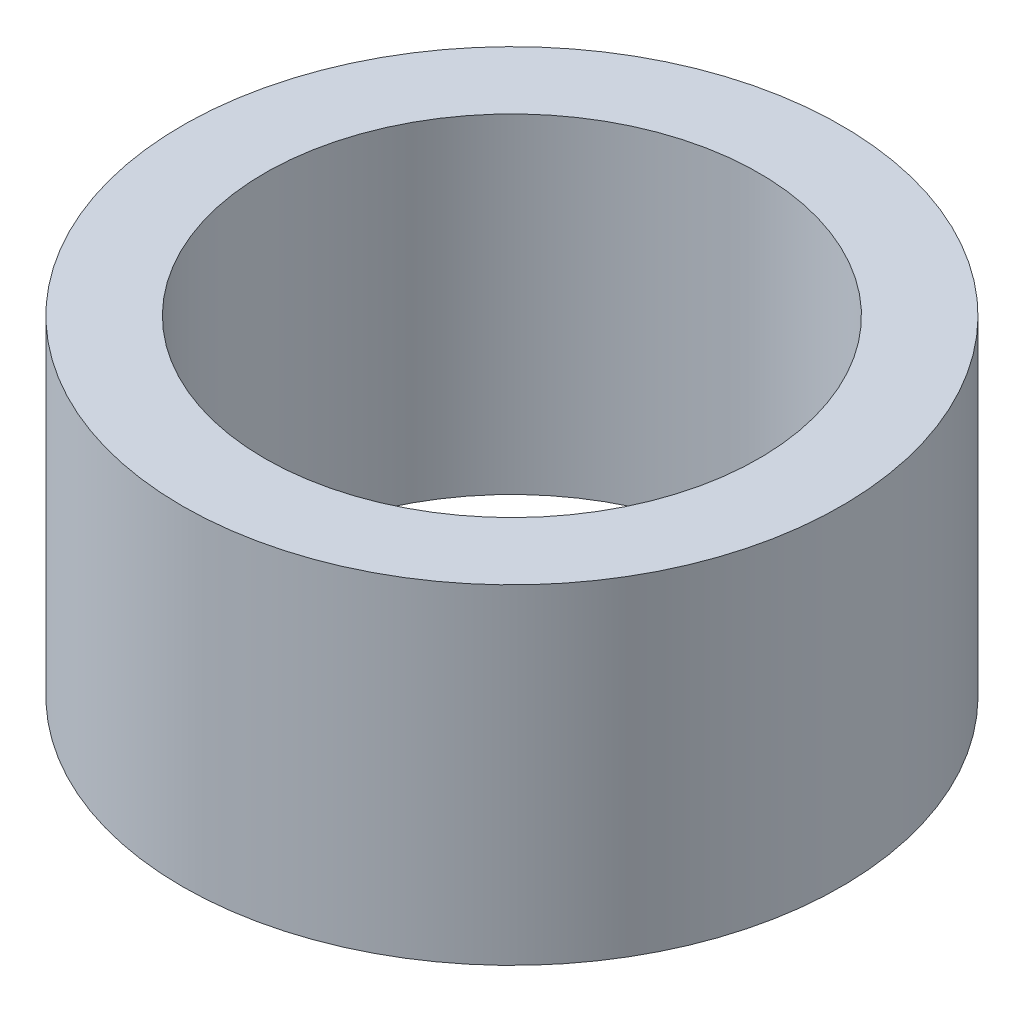
ISO-10303-21;
HEADER;
FILE_DESCRIPTION(('STEP AP214'),'2;1');
FILE_NAME('part.step','',(''),(''),'','','');
FILE_SCHEMA(('AUTOMOTIVE_DESIGN { 1 0 10303 214 1 1 1 1 }'));
ENDSEC;
DATA;
#1=APPLICATION_CONTEXT('core data for automotive mechanical design processes');
#2=APPLICATION_PROTOCOL_DEFINITION('international standard','automotive_design',2000,#1);
#3=PRODUCT_CONTEXT('',#1,'mechanical');
#4=PRODUCT('Part','Part','',(#3));
#5=PRODUCT_RELATED_PRODUCT_CATEGORY('part','',(#4));
#6=PRODUCT_DEFINITION_FORMATION('','',#4);
#7=PRODUCT_DEFINITION_CONTEXT('part definition',#1,'design');
#8=PRODUCT_DEFINITION('design','',#6,#7);
#9=PRODUCT_DEFINITION_SHAPE('','',#8);
#10=(LENGTH_UNIT() NAMED_UNIT(*) SI_UNIT(.MILLI.,.METRE.));
#11=(NAMED_UNIT(*) PLANE_ANGLE_UNIT() SI_UNIT($,.RADIAN.));
#12=(NAMED_UNIT(*) SI_UNIT($,.STERADIAN.) SOLID_ANGLE_UNIT());
#13=UNCERTAINTY_MEASURE_WITH_UNIT(LENGTH_MEASURE(1.E-05),#10,'distance_accuracy_value','');
#14=(GEOMETRIC_REPRESENTATION_CONTEXT(3) GLOBAL_UNCERTAINTY_ASSIGNED_CONTEXT((#13)) GLOBAL_UNIT_ASSIGNED_CONTEXT((#10,
#11,#12)) REPRESENTATION_CONTEXT('',''));
#15=CARTESIAN_POINT('',(0.,0.,0.));
#16=DIRECTION('',(0.,0.,1.));
#17=DIRECTION('',(1.,0.,0.));
#18=AXIS2_PLACEMENT_3D('',#15,#16,#17);
#19=CARTESIAN_POINT('',(0.,20.,0.));
#20=DIRECTION('',(0.,1.,0.));
#21=DIRECTION('',(0.,0.,1.));
#22=AXIS2_PLACEMENT_3D('',#19,#20,#21);
#23=PLANE('',#22);
#24=CARTESIAN_POINT('',(0.,20.,0.));
#25=DIRECTION('',(0.,1.,0.));
#26=DIRECTION('',(0.,0.,1.));
#27=AXIS2_PLACEMENT_3D('',#24,#25,#26);
#28=CIRCLE('',#27,20.);
#29=CARTESIAN_POINT('',(0.,20.,20.));
#30=VERTEX_POINT('',#29);
#31=EDGE_CURVE('E10',#30,#30,#28,.T.);
#32=ORIENTED_EDGE('',*,*,#31,.T.);
#33=EDGE_LOOP('',(#32));
#34=FACE_BOUND('',#33,.T.);
#35=CARTESIAN_POINT('',(0.,20.,0.));
#36=DIRECTION('',(0.,1.,0.));
#37=DIRECTION('',(0.,0.,1.));
#38=AXIS2_PLACEMENT_3D('',#35,#36,#37);
#39=CIRCLE('',#38,15.);
#40=CARTESIAN_POINT('',(0.,20.,15.));
#41=VERTEX_POINT('',#40);
#42=EDGE_CURVE('E41',#41,#41,#39,.T.);
#43=ORIENTED_EDGE('',*,*,#42,.F.);
#44=EDGE_LOOP('',(#43));
#45=FACE_BOUND('',#44,.T.);
#46=ADVANCED_FACE('F30',(#34,#45),#23,.T.);
#47=CARTESIAN_POINT('',(0.,0.,0.));
#48=DIRECTION('',(0.,1.,0.));
#49=DIRECTION('',(0.,0.,1.));
#50=AXIS2_PLACEMENT_3D('',#47,#48,#49);
#51=PLANE('',#50);
#52=CARTESIAN_POINT('',(0.,0.,0.));
#53=DIRECTION('',(0.,1.,0.));
#54=DIRECTION('',(0.,0.,1.));
#55=AXIS2_PLACEMENT_3D('',#52,#53,#54);
#56=CIRCLE('',#55,20.);
#57=CARTESIAN_POINT('',(0.,0.,20.));
#58=VERTEX_POINT('',#57);
#59=EDGE_CURVE('E34',#58,#58,#56,.T.);
#60=ORIENTED_EDGE('',*,*,#59,.F.);
#61=EDGE_LOOP('',(#60));
#62=FACE_BOUND('',#61,.T.);
#63=CARTESIAN_POINT('',(0.,0.,0.));
#64=DIRECTION('',(0.,1.,0.));
#65=DIRECTION('',(0.,0.,1.));
#66=AXIS2_PLACEMENT_3D('',#63,#64,#65);
#67=CIRCLE('',#66,15.);
#68=CARTESIAN_POINT('',(0.,0.,15.));
#69=VERTEX_POINT('',#68);
#70=EDGE_CURVE('E43',#69,#69,#67,.T.);
#71=ORIENTED_EDGE('',*,*,#70,.T.);
#72=EDGE_LOOP('',(#71));
#73=FACE_BOUND('',#72,.T.);
#74=ADVANCED_FACE('F53',(#62,#73),#51,.F.);
#75=CARTESIAN_POINT('',(0.,20.,0.));
#76=DIRECTION('',(0.,-1.,0.));
#77=DIRECTION('',(0.,0.,-1.));
#78=AXIS2_PLACEMENT_3D('',#75,#76,#77);
#79=CYLINDRICAL_SURFACE('',#78,20.);
#80=ORIENTED_EDGE('',*,*,#31,.F.);
#81=EDGE_LOOP('',(#80));
#82=FACE_BOUND('',#81,.T.);
#83=ORIENTED_EDGE('',*,*,#59,.T.);
#84=EDGE_LOOP('',(#83));
#85=FACE_BOUND('',#84,.T.);
#86=ADVANCED_FACE('F32',(#82,#85),#79,.T.);
#87=CARTESIAN_POINT('',(0.,20.,0.));
#88=DIRECTION('',(0.,-1.,0.));
#89=DIRECTION('',(0.,0.,-1.));
#90=AXIS2_PLACEMENT_3D('',#87,#88,#89);
#91=CYLINDRICAL_SURFACE('',#90,15.);
#92=ORIENTED_EDGE('',*,*,#42,.T.);
#93=EDGE_LOOP('',(#92));
#94=FACE_BOUND('',#93,.T.);
#95=ORIENTED_EDGE('',*,*,#70,.F.);
#96=EDGE_LOOP('',(#95));
#97=FACE_BOUND('',#96,.T.);
#98=ADVANCED_FACE('F49',(#94,#97),#91,.F.);
#99=CLOSED_SHELL('',(#46,#74,#86,#98));
#100=MANIFOLD_SOLID_BREP('B2',#99);
#101=ADVANCED_BREP_SHAPE_REPRESENTATION('',(#18,#100),#14);
#102=SHAPE_DEFINITION_REPRESENTATION(#9,#101);
ENDSEC;
END-ISO-10303-21;
